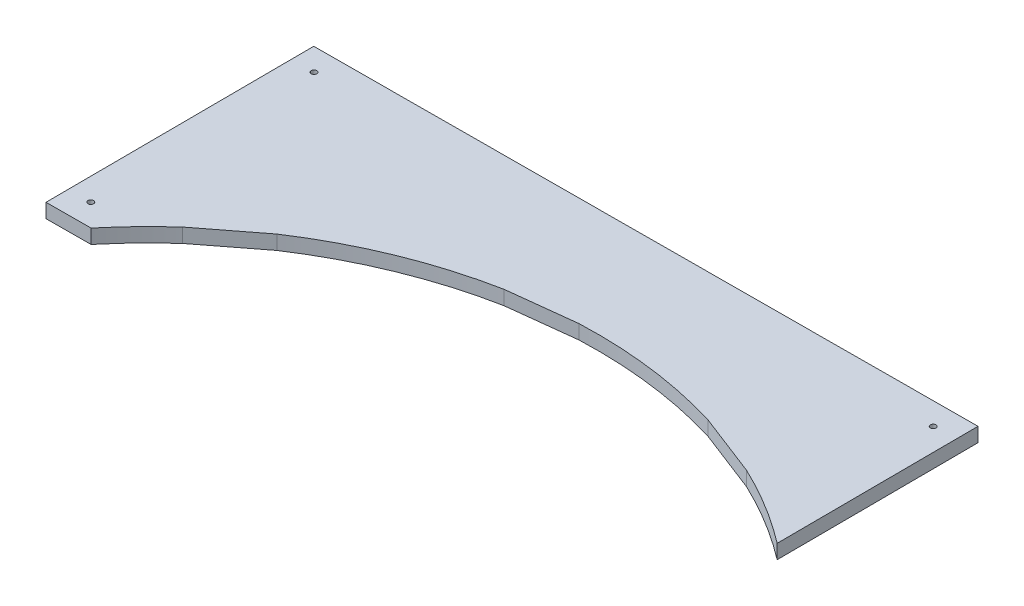
ISO-10303-21;
HEADER;
FILE_DESCRIPTION(('STEP AP214'),'2;1');
FILE_NAME('part.step','',(''),(''),'','','');
FILE_SCHEMA(('AUTOMOTIVE_DESIGN { 1 0 10303 214 1 1 1 1 }'));
ENDSEC;
DATA;
#1=APPLICATION_CONTEXT('core data for automotive mechanical design processes');
#2=APPLICATION_PROTOCOL_DEFINITION('international standard','automotive_design',2000,#1);
#3=PRODUCT_CONTEXT('',#1,'mechanical');
#4=PRODUCT('Part','Part','',(#3));
#5=PRODUCT_RELATED_PRODUCT_CATEGORY('part','',(#4));
#6=PRODUCT_DEFINITION_FORMATION('','',#4);
#7=PRODUCT_DEFINITION_CONTEXT('part definition',#1,'design');
#8=PRODUCT_DEFINITION('design','',#6,#7);
#9=PRODUCT_DEFINITION_SHAPE('','',#8);
#10=(LENGTH_UNIT() NAMED_UNIT(*) SI_UNIT(.MILLI.,.METRE.));
#11=(NAMED_UNIT(*) PLANE_ANGLE_UNIT() SI_UNIT($,.RADIAN.));
#12=(NAMED_UNIT(*) SI_UNIT($,.STERADIAN.) SOLID_ANGLE_UNIT());
#13=UNCERTAINTY_MEASURE_WITH_UNIT(LENGTH_MEASURE(1.E-05),#10,'distance_accuracy_value','');
#14=(GEOMETRIC_REPRESENTATION_CONTEXT(3) GLOBAL_UNCERTAINTY_ASSIGNED_CONTEXT((#13)) GLOBAL_UNIT_ASSIGNED_CONTEXT((#10,
#11,#12)) REPRESENTATION_CONTEXT('',''));
#15=CARTESIAN_POINT('',(0.,0.,0.));
#16=DIRECTION('',(0.,0.,1.));
#17=DIRECTION('',(1.,0.,0.));
#18=AXIS2_PLACEMENT_3D('',#15,#16,#17);
#19=CARTESIAN_POINT('',(173.750588435289,6.35,127.817713477818));
#20=DIRECTION('',(0.,-1.,0.));
#21=DIRECTION('',(0.,0.,-1.));
#22=AXIS2_PLACEMENT_3D('',#19,#20,#21);
#23=PLANE('',#22);
#24=CARTESIAN_POINT('',(173.750588435289,6.35,127.817713477818));
#25=DIRECTION('',(0.,-1.,0.));
#26=DIRECTION('',(0.,0.,-1.));
#27=AXIS2_PLACEMENT_3D('',#24,#25,#26);
#28=CIRCLE('',#27,200.);
#29=CARTESIAN_POINT('',(19.9997920191674,6.35,-0.0912095940634478));
#30=VERTEX_POINT('',#29);
#31=CARTESIAN_POINT('',(40.0056972561308,6.35,-20.8843513480455));
#32=VERTEX_POINT('',#31);
#33=EDGE_CURVE('E191',#30,#32,#28,.T.);
#34=ORIENTED_EDGE('',*,*,#33,.T.);
#35=DIRECTION('',(0.791577074541722,0.,-0.611069337358674));
#36=VECTOR('',#35,1.);
#37=CARTESIAN_POINT('',(40.0056972561308,6.35,-20.8843513480455));
#38=LINE('',#37,#36);
#39=CARTESIAN_POINT('',(63.7563617856595,6.35,-39.2190193199415));
#40=VERTEX_POINT('',#39);
#41=EDGE_CURVE('E109',#32,#40,#38,.T.);
#42=ORIENTED_EDGE('',*,*,#41,.T.);
#43=CARTESIAN_POINT('',(173.750588435289,6.35,127.817713477818));
#44=DIRECTION('',(0.,-1.,0.));
#45=DIRECTION('',(0.,0.,-1.));
#46=AXIS2_PLACEMENT_3D('',#43,#44,#45);
#47=CIRCLE('',#46,200.);
#48=CARTESIAN_POINT('',(135.77356942926,6.35,-68.5435505928126));
#49=VERTEX_POINT('',#48);
#50=EDGE_CURVE('E224',#40,#49,#47,.T.);
#51=ORIENTED_EDGE('',*,*,#50,.T.);
#52=DIRECTION('',(0.993340698225321,0.,-0.115213962909158));
#53=VECTOR('',#52,1.);
#54=CARTESIAN_POINT('',(135.77356942926,6.35,-68.5435505928126));
#55=LINE('',#54,#53);
#56=CARTESIAN_POINT('',(165.773569429232,6.35,-72.0231411234801));
#57=VERTEX_POINT('',#56);
#58=EDGE_CURVE('E244',#49,#57,#55,.T.);
#59=ORIENTED_EDGE('',*,*,#58,.T.);
#60=CARTESIAN_POINT('',(173.750588435289,6.35,127.817713477818));
#61=DIRECTION('',(0.,-1.,0.));
#62=DIRECTION('',(0.,0.,-1.));
#63=AXIS2_PLACEMENT_3D('',#60,#61,#62);
#64=CIRCLE('',#63,200.);
#65=CARTESIAN_POINT('',(231.756657953841,6.35,-63.585776299691));
#66=VERTEX_POINT('',#65);
#67=EDGE_CURVE('E240',#57,#66,#64,.T.);
#68=ORIENTED_EDGE('',*,*,#67,.T.);
#69=DIRECTION('',(0.932524125957965,0.,0.361107677163383));
#70=VECTOR('',#69,1.);
#71=CARTESIAN_POINT('',(231.756657953841,6.35,-63.585776299691));
#72=LINE('',#71,#70);
#73=CARTESIAN_POINT('',(259.779400189254,6.35,-52.734338707143));
#74=VERTEX_POINT('',#73);
#75=EDGE_CURVE('E243',#66,#74,#72,.T.);
#76=ORIENTED_EDGE('',*,*,#75,.T.);
#77=CARTESIAN_POINT('',(173.750588435289,6.35,127.817713477818));
#78=DIRECTION('',(0.,-1.,0.));
#79=DIRECTION('',(0.,0.,-1.));
#80=AXIS2_PLACEMENT_3D('',#77,#78,#79);
#81=CIRCLE('',#80,200.);
#82=CARTESIAN_POINT('',(294.860122159884,6.35,-31.34409362744));
#83=VERTEX_POINT('',#82);
#84=EDGE_CURVE('E248',#74,#83,#81,.T.);
#85=ORIENTED_EDGE('',*,*,#84,.T.);
#86=DIRECTION('',(-0.00456047970317251,0.,-0.999989600958368));
#87=VECTOR('',#86,1.);
#88=CARTESIAN_POINT('',(294.449674718338,6.35,-121.34409362744));
#89=LINE('',#88,#87);
#90=CARTESIAN_POINT('',(294.449674718338,6.35,-121.34409362744));
#91=VERTEX_POINT('',#90);
#92=EDGE_CURVE('E137',#83,#91,#89,.T.);
#93=ORIENTED_EDGE('',*,*,#92,.T.);
#94=DIRECTION('',(-0.999989600958368,0.,0.00456047970317226));
#95=VECTOR('',#94,1.);
#96=CARTESIAN_POINT('',(-0.547257564380663,6.35,-119.998752115004));
#97=LINE('',#96,#95);
#98=CARTESIAN_POINT('',(-0.547257564380663,6.35,-119.998752115004));
#99=VERTEX_POINT('',#98);
#100=EDGE_CURVE('E131',#91,#99,#97,.T.);
#101=ORIENTED_EDGE('',*,*,#100,.T.);
#102=DIRECTION('',(0.00456047970317219,0.,0.999989600958368));
#103=VECTOR('',#102,1.);
#104=CARTESIAN_POINT('',(0.,6.35,0.));
#105=LINE('',#104,#103);
#106=CARTESIAN_POINT('',(0.,6.35,0.));
#107=VERTEX_POINT('',#106);
#108=EDGE_CURVE('E135',#99,#107,#105,.T.);
#109=ORIENTED_EDGE('',*,*,#108,.T.);
#110=DIRECTION('',(0.999989600958369,0.,-0.00456047970317239));
#111=VECTOR('',#110,1.);
#112=CARTESIAN_POINT('',(19.9997920191674,6.35,-0.0912095940634478));
#113=LINE('',#112,#111);
#114=EDGE_CURVE('E57',#107,#30,#113,.T.);
#115=ORIENTED_EDGE('',*,*,#114,.T.);
#116=EDGE_LOOP('',(#34,#42,#51,#59,#68,#76,#85,#93,#101,#109,#115));
#117=FACE_BOUND('',#116,.T.);
#118=CARTESIAN_POINT('',(9.49824324223474,6.35,-110.044460902452));
#119=DIRECTION('',(0.,1.,0.));
#120=DIRECTION('',(0.,0.,1.));
#121=AXIS2_PLACEMENT_3D('',#118,#119,#120);
#122=CIRCLE('',#121,1.25000000000001);
#123=CARTESIAN_POINT('',(9.49824324223474,6.35,-108.794460902452));
#124=VERTEX_POINT('',#123);
#125=EDGE_CURVE('E164',#124,#124,#122,.T.);
#126=ORIENTED_EDGE('',*,*,#125,.F.);
#127=EDGE_LOOP('',(#126));
#128=FACE_BOUND('',#127,.T.);
#129=CARTESIAN_POINT('',(9.95429121255196,6.35,-10.0455008066154));
#130=DIRECTION('',(0.,1.,0.));
#131=DIRECTION('',(0.,0.,1.));
#132=AXIS2_PLACEMENT_3D('',#129,#130,#131);
#133=CIRCLE('',#132,1.25000000000001);
#134=CARTESIAN_POINT('',(9.95429121255196,6.35,-8.7955008066154));
#135=VERTEX_POINT('',#134);
#136=EDGE_CURVE('E309',#135,#135,#133,.T.);
#137=ORIENTED_EDGE('',*,*,#136,.F.);
#138=EDGE_LOOP('',(#137));
#139=FACE_BOUND('',#138,.T.);
#140=CARTESIAN_POINT('',(284.495383505786,6.35,-111.298592820825));
#141=DIRECTION('',(0.,1.,0.));
#142=DIRECTION('',(0.,0.,1.));
#143=AXIS2_PLACEMENT_3D('',#140,#141,#142);
#144=CIRCLE('',#143,1.24999999999995);
#145=CARTESIAN_POINT('',(284.495383505786,6.35,-110.048592820825));
#146=VERTEX_POINT('',#145);
#147=EDGE_CURVE('E298',#146,#146,#144,.T.);
#148=ORIENTED_EDGE('',*,*,#147,.F.);
#149=EDGE_LOOP('',(#148));
#150=FACE_BOUND('',#149,.T.);
#151=ADVANCED_FACE('F39',(#117,#128,#139,#150),#23,.F.);
#152=CARTESIAN_POINT('',(173.750588435289,0.,127.817713477818));
#153=DIRECTION('',(0.,-1.,0.));
#154=DIRECTION('',(0.,0.,-1.));
#155=AXIS2_PLACEMENT_3D('',#152,#153,#154);
#156=PLANE('',#155);
#157=CARTESIAN_POINT('',(9.95429121255196,0.,-10.0455008066154));
#158=DIRECTION('',(0.,1.,0.));
#159=DIRECTION('',(0.,0.,1.));
#160=AXIS2_PLACEMENT_3D('',#157,#158,#159);
#161=CIRCLE('',#160,1.25000000000001);
#162=CARTESIAN_POINT('',(9.95429121255196,0.,-8.7955008066154));
#163=VERTEX_POINT('',#162);
#164=EDGE_CURVE('E306',#163,#163,#161,.T.);
#165=ORIENTED_EDGE('',*,*,#164,.T.);
#166=EDGE_LOOP('',(#165));
#167=FACE_BOUND('',#166,.T.);
#168=CARTESIAN_POINT('',(173.750588435289,0.,127.817713477818));
#169=DIRECTION('',(0.,-1.,0.));
#170=DIRECTION('',(0.,0.,-1.));
#171=AXIS2_PLACEMENT_3D('',#168,#169,#170);
#172=CIRCLE('',#171,200.);
#173=CARTESIAN_POINT('',(19.9997920191674,0.,-0.0912095940634478));
#174=VERTEX_POINT('',#173);
#175=CARTESIAN_POINT('',(40.0056972561308,0.,-20.8843513480455));
#176=VERTEX_POINT('',#175);
#177=EDGE_CURVE('E159',#174,#176,#172,.T.);
#178=ORIENTED_EDGE('',*,*,#177,.F.);
#179=DIRECTION('',(0.999989600958369,0.,-0.00456047970317239));
#180=VECTOR('',#179,1.);
#181=CARTESIAN_POINT('',(19.9997920191674,0.,-0.0912095940634478));
#182=LINE('',#181,#180);
#183=CARTESIAN_POINT('',(0.,0.,0.));
#184=VERTEX_POINT('',#183);
#185=EDGE_CURVE('E101',#184,#174,#182,.T.);
#186=ORIENTED_EDGE('',*,*,#185,.F.);
#187=DIRECTION('',(0.00456047970317219,0.,0.999989600958368));
#188=VECTOR('',#187,1.);
#189=CARTESIAN_POINT('',(0.,0.,0.));
#190=LINE('',#189,#188);
#191=CARTESIAN_POINT('',(-0.547257564380663,0.,-119.998752115004));
#192=VERTEX_POINT('',#191);
#193=EDGE_CURVE('E95',#192,#184,#190,.T.);
#194=ORIENTED_EDGE('',*,*,#193,.F.);
#195=DIRECTION('',(-0.999989600958368,0.,0.00456047970317226));
#196=VECTOR('',#195,1.);
#197=CARTESIAN_POINT('',(-0.547257564380663,0.,-119.998752115004));
#198=LINE('',#197,#196);
#199=CARTESIAN_POINT('',(294.449674718338,0.,-121.34409362744));
#200=VERTEX_POINT('',#199);
#201=EDGE_CURVE('E146',#200,#192,#198,.T.);
#202=ORIENTED_EDGE('',*,*,#201,.F.);
#203=DIRECTION('',(-0.00456047970317251,0.,-0.999989600958368));
#204=VECTOR('',#203,1.);
#205=CARTESIAN_POINT('',(294.449674718338,0.,-121.34409362744));
#206=LINE('',#205,#204);
#207=CARTESIAN_POINT('',(294.860122159884,0.,-31.34409362744));
#208=VERTEX_POINT('',#207);
#209=EDGE_CURVE('E182',#208,#200,#206,.T.);
#210=ORIENTED_EDGE('',*,*,#209,.F.);
#211=CARTESIAN_POINT('',(173.750588435289,0.,127.817713477818));
#212=DIRECTION('',(0.,-1.,0.));
#213=DIRECTION('',(0.,0.,-1.));
#214=AXIS2_PLACEMENT_3D('',#211,#212,#213);
#215=CIRCLE('',#214,200.);
#216=CARTESIAN_POINT('',(259.779400189254,0.,-52.734338707143));
#217=VERTEX_POINT('',#216);
#218=EDGE_CURVE('E179',#217,#208,#215,.T.);
#219=ORIENTED_EDGE('',*,*,#218,.F.);
#220=DIRECTION('',(0.932524125957965,0.,0.361107677163383));
#221=VECTOR('',#220,1.);
#222=CARTESIAN_POINT('',(231.756657953841,0.,-63.585776299691));
#223=LINE('',#222,#221);
#224=CARTESIAN_POINT('',(231.756657953841,0.,-63.585776299691));
#225=VERTEX_POINT('',#224);
#226=EDGE_CURVE('E176',#225,#217,#223,.T.);
#227=ORIENTED_EDGE('',*,*,#226,.F.);
#228=CARTESIAN_POINT('',(173.750588435289,0.,127.817713477818));
#229=DIRECTION('',(0.,-1.,0.));
#230=DIRECTION('',(0.,0.,-1.));
#231=AXIS2_PLACEMENT_3D('',#228,#229,#230);
#232=CIRCLE('',#231,200.);
#233=CARTESIAN_POINT('',(165.773569429232,0.,-72.0231411234801));
#234=VERTEX_POINT('',#233);
#235=EDGE_CURVE('E173',#234,#225,#232,.T.);
#236=ORIENTED_EDGE('',*,*,#235,.F.);
#237=DIRECTION('',(0.993340698225321,0.,-0.115213962909158));
#238=VECTOR('',#237,1.);
#239=CARTESIAN_POINT('',(135.77356942926,0.,-68.5435505928126));
#240=LINE('',#239,#238);
#241=CARTESIAN_POINT('',(135.77356942926,0.,-68.5435505928126));
#242=VERTEX_POINT('',#241);
#243=EDGE_CURVE('E170',#242,#234,#240,.T.);
#244=ORIENTED_EDGE('',*,*,#243,.F.);
#245=CARTESIAN_POINT('',(173.750588435289,0.,127.817713477818));
#246=DIRECTION('',(0.,-1.,0.));
#247=DIRECTION('',(0.,0.,-1.));
#248=AXIS2_PLACEMENT_3D('',#245,#246,#247);
#249=CIRCLE('',#248,200.);
#250=CARTESIAN_POINT('',(63.7563617856595,0.,-39.2190193199415));
#251=VERTEX_POINT('',#250);
#252=EDGE_CURVE('E167',#251,#242,#249,.T.);
#253=ORIENTED_EDGE('',*,*,#252,.F.);
#254=DIRECTION('',(0.791577074541722,0.,-0.611069337358674));
#255=VECTOR('',#254,1.);
#256=CARTESIAN_POINT('',(40.0056972561308,0.,-20.8843513480455));
#257=LINE('',#256,#255);
#258=EDGE_CURVE('E163',#176,#251,#257,.T.);
#259=ORIENTED_EDGE('',*,*,#258,.F.);
#260=EDGE_LOOP('',(#178,#186,#194,#202,#210,#219,#227,#236,#244,#253,#259));
#261=FACE_BOUND('',#260,.T.);
#262=CARTESIAN_POINT('',(9.49824324223474,0.,-110.044460902452));
#263=DIRECTION('',(0.,1.,0.));
#264=DIRECTION('',(0.,0.,1.));
#265=AXIS2_PLACEMENT_3D('',#262,#263,#264);
#266=CIRCLE('',#265,1.25000000000001);
#267=CARTESIAN_POINT('',(9.49824324223474,0.,-108.794460902452));
#268=VERTEX_POINT('',#267);
#269=EDGE_CURVE('E313',#268,#268,#266,.T.);
#270=ORIENTED_EDGE('',*,*,#269,.T.);
#271=EDGE_LOOP('',(#270));
#272=FACE_BOUND('',#271,.T.);
#273=CARTESIAN_POINT('',(284.495383505786,0.,-111.298592820825));
#274=DIRECTION('',(0.,1.,0.));
#275=DIRECTION('',(0.,0.,1.));
#276=AXIS2_PLACEMENT_3D('',#273,#274,#275);
#277=CIRCLE('',#276,1.24999999999995);
#278=CARTESIAN_POINT('',(284.495383505786,0.,-110.048592820825));
#279=VERTEX_POINT('',#278);
#280=EDGE_CURVE('E301',#279,#279,#277,.T.);
#281=ORIENTED_EDGE('',*,*,#280,.T.);
#282=EDGE_LOOP('',(#281));
#283=FACE_BOUND('',#282,.T.);
#284=ADVANCED_FACE('F228',(#167,#261,#272,#283),#156,.T.);
#285=CARTESIAN_POINT('',(173.750588435289,6.35,127.817713477818));
#286=DIRECTION('',(0.,-1.,0.));
#287=DIRECTION('',(0.,0.,-1.));
#288=AXIS2_PLACEMENT_3D('',#285,#286,#287);
#289=CYLINDRICAL_SURFACE('',#288,200.);
#290=ORIENTED_EDGE('',*,*,#177,.T.);
#291=DIRECTION('',(0.,-1.,0.));
#292=VECTOR('',#291,1.);
#293=CARTESIAN_POINT('',(40.0056972561308,6.35,-20.8843513480455));
#294=LINE('',#293,#292);
#295=EDGE_CURVE('E11',#32,#176,#294,.T.);
#296=ORIENTED_EDGE('',*,*,#295,.F.);
#297=ORIENTED_EDGE('',*,*,#33,.F.);
#298=DIRECTION('',(0.,-1.,0.));
#299=VECTOR('',#298,1.);
#300=CARTESIAN_POINT('',(19.9997920191674,6.35,-0.0912095940634478));
#301=LINE('',#300,#299);
#302=EDGE_CURVE('E155',#30,#174,#301,.T.);
#303=ORIENTED_EDGE('',*,*,#302,.T.);
#304=EDGE_LOOP('',(#290,#296,#297,#303));
#305=FACE_BOUND('',#304,.T.);
#306=ADVANCED_FACE('F41',(#305),#289,.F.);
#307=CARTESIAN_POINT('',(40.0056972561308,6.35,-20.8843513480455));
#308=DIRECTION('',(-0.611069337358674,0.,-0.791577074541722));
#309=DIRECTION('',(-0.791577074541722,0.,0.611069337358674));
#310=AXIS2_PLACEMENT_3D('',#307,#308,#309);
#311=PLANE('',#310);
#312=ORIENTED_EDGE('',*,*,#258,.T.);
#313=DIRECTION('',(0.,-1.,0.));
#314=VECTOR('',#313,1.);
#315=CARTESIAN_POINT('',(63.7563617856595,6.35,-39.2190193199415));
#316=LINE('',#315,#314);
#317=EDGE_CURVE('E49',#40,#251,#316,.T.);
#318=ORIENTED_EDGE('',*,*,#317,.F.);
#319=ORIENTED_EDGE('',*,*,#41,.F.);
#320=ORIENTED_EDGE('',*,*,#295,.T.);
#321=EDGE_LOOP('',(#312,#318,#319,#320));
#322=FACE_BOUND('',#321,.T.);
#323=ADVANCED_FACE('F412',(#322),#311,.F.);
#324=CARTESIAN_POINT('',(173.750588435289,6.35,127.817713477818));
#325=DIRECTION('',(0.,-1.,0.));
#326=DIRECTION('',(0.,0.,-1.));
#327=AXIS2_PLACEMENT_3D('',#324,#325,#326);
#328=CYLINDRICAL_SURFACE('',#327,200.);
#329=ORIENTED_EDGE('',*,*,#252,.T.);
#330=DIRECTION('',(0.,-1.,0.));
#331=VECTOR('',#330,1.);
#332=CARTESIAN_POINT('',(135.77356942926,6.35,-68.5435505928126));
#333=LINE('',#332,#331);
#334=EDGE_CURVE('E214',#49,#242,#333,.T.);
#335=ORIENTED_EDGE('',*,*,#334,.F.);
#336=ORIENTED_EDGE('',*,*,#50,.F.);
#337=ORIENTED_EDGE('',*,*,#317,.T.);
#338=EDGE_LOOP('',(#329,#335,#336,#337));
#339=FACE_BOUND('',#338,.T.);
#340=ADVANCED_FACE('F222',(#339),#328,.F.);
#341=CARTESIAN_POINT('',(135.77356942926,6.35,-68.5435505928126));
#342=DIRECTION('',(-0.115213962909158,0.,-0.993340698225321));
#343=DIRECTION('',(-0.993340698225321,0.,0.115213962909158));
#344=AXIS2_PLACEMENT_3D('',#341,#342,#343);
#345=PLANE('',#344);
#346=ORIENTED_EDGE('',*,*,#243,.T.);
#347=DIRECTION('',(0.,-1.,0.));
#348=VECTOR('',#347,1.);
#349=CARTESIAN_POINT('',(165.773569429232,6.35,-72.0231411234801));
#350=LINE('',#349,#348);
#351=EDGE_CURVE('E210',#57,#234,#350,.T.);
#352=ORIENTED_EDGE('',*,*,#351,.F.);
#353=ORIENTED_EDGE('',*,*,#58,.F.);
#354=ORIENTED_EDGE('',*,*,#334,.T.);
#355=EDGE_LOOP('',(#346,#352,#353,#354));
#356=FACE_BOUND('',#355,.T.);
#357=ADVANCED_FACE('F234',(#356),#345,.F.);
#358=CARTESIAN_POINT('',(173.750588435289,6.35,127.817713477818));
#359=DIRECTION('',(0.,-1.,0.));
#360=DIRECTION('',(0.,0.,-1.));
#361=AXIS2_PLACEMENT_3D('',#358,#359,#360);
#362=CYLINDRICAL_SURFACE('',#361,200.);
#363=ORIENTED_EDGE('',*,*,#235,.T.);
#364=DIRECTION('',(0.,-1.,0.));
#365=VECTOR('',#364,1.);
#366=CARTESIAN_POINT('',(231.756657953841,6.35,-63.585776299691));
#367=LINE('',#366,#365);
#368=EDGE_CURVE('E206',#66,#225,#367,.T.);
#369=ORIENTED_EDGE('',*,*,#368,.F.);
#370=ORIENTED_EDGE('',*,*,#67,.F.);
#371=ORIENTED_EDGE('',*,*,#351,.T.);
#372=EDGE_LOOP('',(#363,#369,#370,#371));
#373=FACE_BOUND('',#372,.T.);
#374=ADVANCED_FACE('F238',(#373),#362,.F.);
#375=CARTESIAN_POINT('',(231.756657953841,6.35,-63.585776299691));
#376=DIRECTION('',(0.361107677163383,0.,-0.932524125957965));
#377=DIRECTION('',(-0.932524125957965,0.,-0.361107677163383));
#378=AXIS2_PLACEMENT_3D('',#375,#376,#377);
#379=PLANE('',#378);
#380=ORIENTED_EDGE('',*,*,#226,.T.);
#381=DIRECTION('',(0.,-1.,0.));
#382=VECTOR('',#381,1.);
#383=CARTESIAN_POINT('',(259.779400189254,6.35,-52.734338707143));
#384=LINE('',#383,#382);
#385=EDGE_CURVE('E202',#74,#217,#384,.T.);
#386=ORIENTED_EDGE('',*,*,#385,.F.);
#387=ORIENTED_EDGE('',*,*,#75,.F.);
#388=ORIENTED_EDGE('',*,*,#368,.T.);
#389=EDGE_LOOP('',(#380,#386,#387,#388));
#390=FACE_BOUND('',#389,.T.);
#391=ADVANCED_FACE('F378',(#390),#379,.F.);
#392=CARTESIAN_POINT('',(173.750588435289,6.35,127.817713477818));
#393=DIRECTION('',(0.,-1.,0.));
#394=DIRECTION('',(0.,0.,-1.));
#395=AXIS2_PLACEMENT_3D('',#392,#393,#394);
#396=CYLINDRICAL_SURFACE('',#395,200.);
#397=ORIENTED_EDGE('',*,*,#218,.T.);
#398=DIRECTION('',(0.,-1.,0.));
#399=VECTOR('',#398,1.);
#400=CARTESIAN_POINT('',(294.860122159884,6.35,-31.34409362744));
#401=LINE('',#400,#399);
#402=EDGE_CURVE('E198',#83,#208,#401,.T.);
#403=ORIENTED_EDGE('',*,*,#402,.F.);
#404=ORIENTED_EDGE('',*,*,#84,.F.);
#405=ORIENTED_EDGE('',*,*,#385,.T.);
#406=EDGE_LOOP('',(#397,#403,#404,#405));
#407=FACE_BOUND('',#406,.T.);
#408=ADVANCED_FACE('F259',(#407),#396,.F.);
#409=CARTESIAN_POINT('',(294.449674718338,6.35,-121.34409362744));
#410=DIRECTION('',(-0.999989600958368,0.,0.00456047970317251));
#411=DIRECTION('',(0.00456047970317251,0.,0.999989600958369));
#412=AXIS2_PLACEMENT_3D('',#409,#410,#411);
#413=PLANE('',#412);
#414=ORIENTED_EDGE('',*,*,#209,.T.);
#415=DIRECTION('',(0.,-1.,0.));
#416=VECTOR('',#415,1.);
#417=CARTESIAN_POINT('',(294.449674718338,6.35,-121.34409362744));
#418=LINE('',#417,#416);
#419=EDGE_CURVE('E148',#91,#200,#418,.T.);
#420=ORIENTED_EDGE('',*,*,#419,.F.);
#421=ORIENTED_EDGE('',*,*,#92,.F.);
#422=ORIENTED_EDGE('',*,*,#402,.T.);
#423=EDGE_LOOP('',(#414,#420,#421,#422));
#424=FACE_BOUND('',#423,.T.);
#425=ADVANCED_FACE('F263',(#424),#413,.F.);
#426=CARTESIAN_POINT('',(-0.547257564380663,6.35,-119.998752115004));
#427=DIRECTION('',(0.00456047970317226,0.,0.999989600958368));
#428=DIRECTION('',(0.999989600958369,0.,-0.00456047970317226));
#429=AXIS2_PLACEMENT_3D('',#426,#427,#428);
#430=PLANE('',#429);
#431=ORIENTED_EDGE('',*,*,#201,.T.);
#432=DIRECTION('',(0.,-1.,0.));
#433=VECTOR('',#432,1.);
#434=CARTESIAN_POINT('',(-0.547257564380663,6.35,-119.998752115004));
#435=LINE('',#434,#433);
#436=EDGE_CURVE('E143',#99,#192,#435,.T.);
#437=ORIENTED_EDGE('',*,*,#436,.F.);
#438=ORIENTED_EDGE('',*,*,#100,.F.);
#439=ORIENTED_EDGE('',*,*,#419,.T.);
#440=EDGE_LOOP('',(#431,#437,#438,#439));
#441=FACE_BOUND('',#440,.T.);
#442=ADVANCED_FACE('F144',(#441),#430,.F.);
#443=CARTESIAN_POINT('',(0.,6.35,0.));
#444=DIRECTION('',(0.999989600958368,0.,-0.00456047970317219));
#445=DIRECTION('',(-0.00456047970317219,0.,-0.999989600958369));
#446=AXIS2_PLACEMENT_3D('',#443,#444,#445);
#447=PLANE('',#446);
#448=ORIENTED_EDGE('',*,*,#193,.T.);
#449=DIRECTION('',(0.,-1.,0.));
#450=VECTOR('',#449,1.);
#451=CARTESIAN_POINT('',(0.,6.35,0.));
#452=LINE('',#451,#450);
#453=EDGE_CURVE('E149',#107,#184,#452,.T.);
#454=ORIENTED_EDGE('',*,*,#453,.F.);
#455=ORIENTED_EDGE('',*,*,#108,.F.);
#456=ORIENTED_EDGE('',*,*,#436,.T.);
#457=EDGE_LOOP('',(#448,#454,#455,#456));
#458=FACE_BOUND('',#457,.T.);
#459=ADVANCED_FACE('F151',(#458),#447,.F.);
#460=CARTESIAN_POINT('',(19.9997920191674,6.35,-0.0912095940634478));
#461=DIRECTION('',(-0.00456047970317239,0.,-0.999989600958368));
#462=DIRECTION('',(-0.999989600958369,0.,0.00456047970317239));
#463=AXIS2_PLACEMENT_3D('',#460,#461,#462);
#464=PLANE('',#463);
#465=ORIENTED_EDGE('',*,*,#185,.T.);
#466=ORIENTED_EDGE('',*,*,#302,.F.);
#467=ORIENTED_EDGE('',*,*,#114,.F.);
#468=ORIENTED_EDGE('',*,*,#453,.T.);
#469=EDGE_LOOP('',(#465,#466,#467,#468));
#470=FACE_BOUND('',#469,.T.);
#471=ADVANCED_FACE('F267',(#470),#464,.F.);
#472=CARTESIAN_POINT('',(9.49824324223474,6.35,-110.044460902452));
#473=DIRECTION('',(0.,-1.,0.));
#474=DIRECTION('',(0.,0.,-1.));
#475=AXIS2_PLACEMENT_3D('',#472,#473,#474);
#476=CYLINDRICAL_SURFACE('',#475,1.25000000000001);
#477=ORIENTED_EDGE('',*,*,#125,.T.);
#478=EDGE_LOOP('',(#477));
#479=FACE_BOUND('',#478,.T.);
#480=ORIENTED_EDGE('',*,*,#269,.F.);
#481=EDGE_LOOP('',(#480));
#482=FACE_BOUND('',#481,.T.);
#483=ADVANCED_FACE('F269',(#479,#482),#476,.F.);
#484=CARTESIAN_POINT('',(9.95429121255196,6.35,-10.0455008066154));
#485=DIRECTION('',(0.,-1.,0.));
#486=DIRECTION('',(0.,0.,-1.));
#487=AXIS2_PLACEMENT_3D('',#484,#485,#486);
#488=CYLINDRICAL_SURFACE('',#487,1.25000000000001);
#489=ORIENTED_EDGE('',*,*,#136,.T.);
#490=EDGE_LOOP('',(#489));
#491=FACE_BOUND('',#490,.T.);
#492=ORIENTED_EDGE('',*,*,#164,.F.);
#493=EDGE_LOOP('',(#492));
#494=FACE_BOUND('',#493,.T.);
#495=ADVANCED_FACE('F275',(#491,#494),#488,.F.);
#496=CARTESIAN_POINT('',(284.495383505786,6.35,-111.298592820825));
#497=DIRECTION('',(0.,-1.,0.));
#498=DIRECTION('',(0.,0.,-1.));
#499=AXIS2_PLACEMENT_3D('',#496,#497,#498);
#500=CYLINDRICAL_SURFACE('',#499,1.24999999999995);
#501=ORIENTED_EDGE('',*,*,#147,.T.);
#502=EDGE_LOOP('',(#501));
#503=FACE_BOUND('',#502,.T.);
#504=ORIENTED_EDGE('',*,*,#280,.F.);
#505=EDGE_LOOP('',(#504));
#506=FACE_BOUND('',#505,.T.);
#507=ADVANCED_FACE('F289',(#503,#506),#500,.F.);
#508=CLOSED_SHELL('',(#151,#284,#306,#323,#340,#357,#374,#391,#408,#425,#442,#459,#471,#483,
#495,#507));
#509=MANIFOLD_SOLID_BREP('B2',#508);
#510=ADVANCED_BREP_SHAPE_REPRESENTATION('',(#18,#509),#14);
#511=SHAPE_DEFINITION_REPRESENTATION(#9,#510);
ENDSEC;
END-ISO-10303-21;
